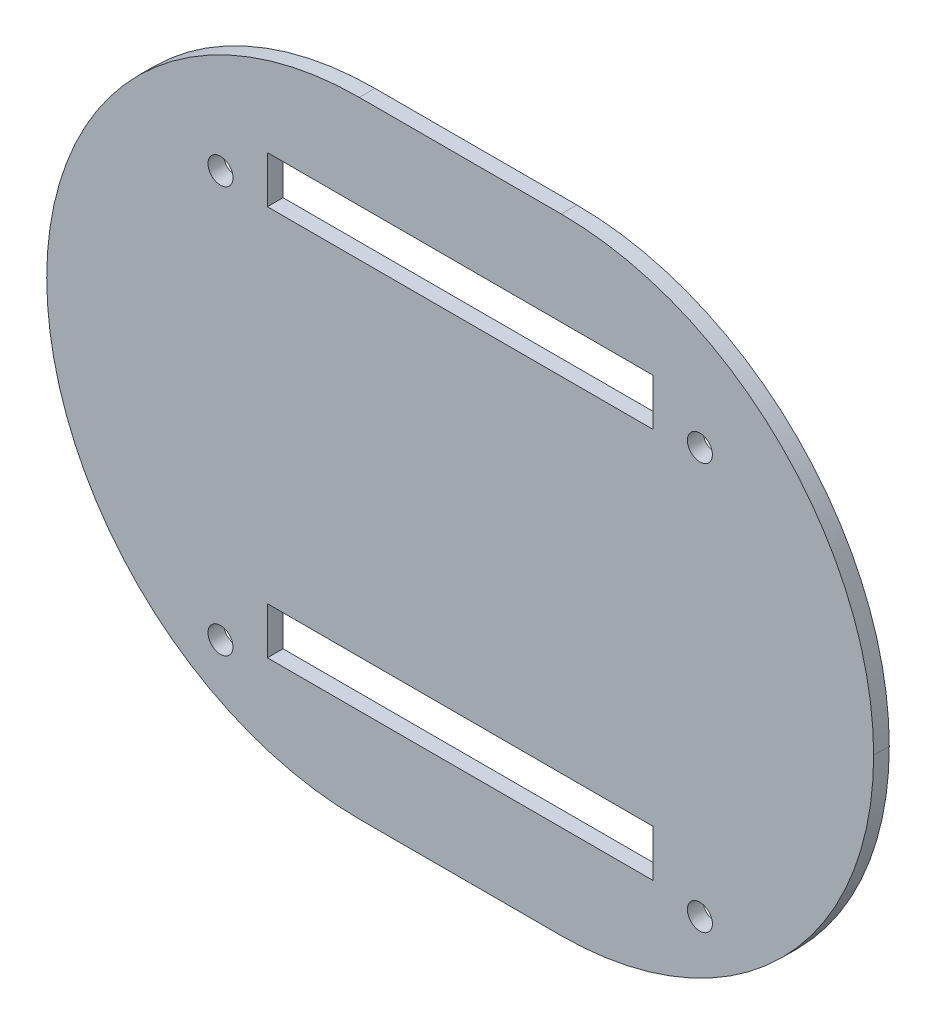
ISO-10303-21;
HEADER;
FILE_DESCRIPTION(('STEP AP214'),'2;1');
FILE_NAME('part.step','',(''),(''),'','','');
FILE_SCHEMA(('AUTOMOTIVE_DESIGN { 1 0 10303 214 1 1 1 1 }'));
ENDSEC;
DATA;
#1=APPLICATION_CONTEXT('core data for automotive mechanical design processes');
#2=APPLICATION_PROTOCOL_DEFINITION('international standard','automotive_design',2000,#1);
#3=PRODUCT_CONTEXT('',#1,'mechanical');
#4=PRODUCT('Part','Part','',(#3));
#5=PRODUCT_RELATED_PRODUCT_CATEGORY('part','',(#4));
#6=PRODUCT_DEFINITION_FORMATION('','',#4);
#7=PRODUCT_DEFINITION_CONTEXT('part definition',#1,'design');
#8=PRODUCT_DEFINITION('design','',#6,#7);
#9=PRODUCT_DEFINITION_SHAPE('','',#8);
#10=(LENGTH_UNIT() NAMED_UNIT(*) SI_UNIT(.MILLI.,.METRE.));
#11=(NAMED_UNIT(*) PLANE_ANGLE_UNIT() SI_UNIT($,.RADIAN.));
#12=(NAMED_UNIT(*) SI_UNIT($,.STERADIAN.) SOLID_ANGLE_UNIT());
#13=UNCERTAINTY_MEASURE_WITH_UNIT(LENGTH_MEASURE(1.E-05),#10,'distance_accuracy_value','');
#14=(GEOMETRIC_REPRESENTATION_CONTEXT(3) GLOBAL_UNCERTAINTY_ASSIGNED_CONTEXT((#13)) GLOBAL_UNIT_ASSIGNED_CONTEXT((#10,
#11,#12)) REPRESENTATION_CONTEXT('',''));
#15=CARTESIAN_POINT('',(0.,0.,0.));
#16=DIRECTION('',(0.,0.,1.));
#17=DIRECTION('',(1.,0.,0.));
#18=AXIS2_PLACEMENT_3D('',#15,#16,#17);
#19=CARTESIAN_POINT('',(0.,0.,0.));
#20=DIRECTION('',(0.,0.,-1.));
#21=DIRECTION('',(-1.,0.,0.));
#22=AXIS2_PLACEMENT_3D('',#19,#20,#21);
#23=PLANE('',#22);
#24=DIRECTION('',(0.,1.,0.));
#25=VECTOR('',#24,1.);
#26=CARTESIAN_POINT('',(-209.200541186636,-75.,0.));
#27=LINE('',#26,#25);
#28=CARTESIAN_POINT('',(-209.200541186636,-75.,0.));
#29=VERTEX_POINT('',#28);
#30=CARTESIAN_POINT('',(-209.200541186636,-60.,0.));
#31=VERTEX_POINT('',#30);
#32=EDGE_CURVE('E51',#29,#31,#27,.T.);
#33=ORIENTED_EDGE('',*,*,#32,.F.);
#34=DIRECTION('',(-1.,0.,0.));
#35=VECTOR('',#34,1.);
#36=CARTESIAN_POINT('',(-209.200541186636,-75.,0.));
#37=LINE('',#36,#35);
#38=CARTESIAN_POINT('',(-85.7994588132849,-75.,0.));
#39=VERTEX_POINT('',#38);
#40=EDGE_CURVE('E157',#39,#29,#37,.T.);
#41=ORIENTED_EDGE('',*,*,#40,.F.);
#42=DIRECTION('',(0.,-1.,0.));
#43=VECTOR('',#42,1.);
#44=CARTESIAN_POINT('',(-85.7994588132849,-75.,0.));
#45=LINE('',#44,#43);
#46=CARTESIAN_POINT('',(-85.7994588132849,-60.,0.));
#47=VERTEX_POINT('',#46);
#48=EDGE_CURVE('E160',#47,#39,#45,.T.);
#49=ORIENTED_EDGE('',*,*,#48,.F.);
#50=DIRECTION('',(1.,0.,0.));
#51=VECTOR('',#50,1.);
#52=CARTESIAN_POINT('',(-209.200541186636,-60.,0.));
#53=LINE('',#52,#51);
#54=EDGE_CURVE('E166',#31,#47,#53,.T.);
#55=ORIENTED_EDGE('',*,*,#54,.F.);
#56=EDGE_LOOP('',(#33,#41,#49,#55));
#57=FACE_BOUND('',#56,.T.);
#58=DIRECTION('',(1.,0.,0.));
#59=VECTOR('',#58,1.);
#60=CARTESIAN_POINT('',(-209.200541186636,-185.,0.));
#61=LINE('',#60,#59);
#62=CARTESIAN_POINT('',(-209.200541186636,-185.,0.));
#63=VERTEX_POINT('',#62);
#64=CARTESIAN_POINT('',(-85.7994588132849,-185.,0.));
#65=VERTEX_POINT('',#64);
#66=EDGE_CURVE('E59',#63,#65,#61,.T.);
#67=ORIENTED_EDGE('',*,*,#66,.F.);
#68=DIRECTION('',(0.,1.,0.));
#69=VECTOR('',#68,1.);
#70=CARTESIAN_POINT('',(-209.200541186636,-185.,0.));
#71=LINE('',#70,#69);
#72=CARTESIAN_POINT('',(-209.200541186636,-200.,0.));
#73=VERTEX_POINT('',#72);
#74=EDGE_CURVE('E181',#73,#63,#71,.T.);
#75=ORIENTED_EDGE('',*,*,#74,.F.);
#76=DIRECTION('',(-1.,0.,0.));
#77=VECTOR('',#76,1.);
#78=CARTESIAN_POINT('',(-209.200541186636,-200.,0.));
#79=LINE('',#78,#77);
#80=CARTESIAN_POINT('',(-85.7994588132849,-200.,0.));
#81=VERTEX_POINT('',#80);
#82=EDGE_CURVE('E195',#81,#73,#79,.T.);
#83=ORIENTED_EDGE('',*,*,#82,.F.);
#84=DIRECTION('',(0.,-1.,0.));
#85=VECTOR('',#84,1.);
#86=CARTESIAN_POINT('',(-85.7994588132849,-185.,0.));
#87=LINE('',#86,#85);
#88=EDGE_CURVE('E192',#65,#81,#87,.T.);
#89=ORIENTED_EDGE('',*,*,#88,.F.);
#90=EDGE_LOOP('',(#67,#75,#83,#89));
#91=FACE_BOUND('',#90,.T.);
#92=CARTESIAN_POINT('',(-224.200541186636,-202.530608434768,0.));
#93=DIRECTION('',(0.,0.,1.));
#94=DIRECTION('',(1.,0.,0.));
#95=AXIS2_PLACEMENT_3D('',#92,#93,#94);
#96=CIRCLE('',#95,4.);
#97=CARTESIAN_POINT('',(-220.200541186636,-202.530608434768,0.));
#98=VERTEX_POINT('',#97);
#99=EDGE_CURVE('E206',#98,#98,#96,.F.);
#100=ORIENTED_EDGE('',*,*,#99,.F.);
#101=EDGE_LOOP('',(#100));
#102=FACE_BOUND('',#101,.T.);
#103=CARTESIAN_POINT('',(-70.7994588132849,-202.530608434768,0.));
#104=DIRECTION('',(0.,0.,1.));
#105=DIRECTION('',(1.,0.,0.));
#106=AXIS2_PLACEMENT_3D('',#103,#104,#105);
#107=CIRCLE('',#106,4.00000000000001);
#108=CARTESIAN_POINT('',(-66.7994588132849,-202.530608434768,0.));
#109=VERTEX_POINT('',#108);
#110=EDGE_CURVE('E224',#109,#109,#107,.T.);
#111=ORIENTED_EDGE('',*,*,#110,.T.);
#112=EDGE_LOOP('',(#111));
#113=FACE_BOUND('',#112,.T.);
#114=CARTESIAN_POINT('',(-179.8,-130.,0.));
#115=DIRECTION('',(0.,0.,-1.));
#116=DIRECTION('',(-1.,0.,0.));
#117=AXIS2_PLACEMENT_3D('',#114,#115,#116);
#118=CIRCLE('',#117,100.);
#119=CARTESIAN_POINT('',(-179.8,-230.,0.));
#120=VERTEX_POINT('',#119);
#121=CARTESIAN_POINT('',(-279.8,-130.,0.));
#122=VERTEX_POINT('',#121);
#123=EDGE_CURVE('E246',#120,#122,#118,.T.);
#124=ORIENTED_EDGE('',*,*,#123,.T.);
#125=CARTESIAN_POINT('',(-179.8,-130.,0.));
#126=DIRECTION('',(0.,0.,-1.));
#127=DIRECTION('',(-1.,0.,0.));
#128=AXIS2_PLACEMENT_3D('',#125,#126,#127);
#129=CIRCLE('',#128,100.);
#130=CARTESIAN_POINT('',(-179.8,-30.,0.));
#131=VERTEX_POINT('',#130);
#132=EDGE_CURVE('E248',#122,#131,#129,.T.);
#133=ORIENTED_EDGE('',*,*,#132,.T.);
#134=DIRECTION('',(1.,0.,0.));
#135=VECTOR('',#134,1.);
#136=CARTESIAN_POINT('',(-15.2,-30.,0.));
#137=LINE('',#136,#135);
#138=CARTESIAN_POINT('',(-115.2,-30.,0.));
#139=VERTEX_POINT('',#138);
#140=EDGE_CURVE('E237',#131,#139,#137,.T.);
#141=ORIENTED_EDGE('',*,*,#140,.T.);
#142=CARTESIAN_POINT('',(-115.2,-130.,0.));
#143=DIRECTION('',(0.,0.,-1.));
#144=DIRECTION('',(-1.,0.,0.));
#145=AXIS2_PLACEMENT_3D('',#142,#143,#144);
#146=CIRCLE('',#145,100.);
#147=CARTESIAN_POINT('',(-15.2,-130.,0.));
#148=VERTEX_POINT('',#147);
#149=EDGE_CURVE('E244',#139,#148,#146,.T.);
#150=ORIENTED_EDGE('',*,*,#149,.T.);
#151=CARTESIAN_POINT('',(-115.2,-130.,0.));
#152=DIRECTION('',(0.,0.,-1.));
#153=DIRECTION('',(-1.,0.,0.));
#154=AXIS2_PLACEMENT_3D('',#151,#152,#153);
#155=CIRCLE('',#154,100.);
#156=CARTESIAN_POINT('',(-115.2,-230.,0.));
#157=VERTEX_POINT('',#156);
#158=EDGE_CURVE('E236',#148,#157,#155,.T.);
#159=ORIENTED_EDGE('',*,*,#158,.T.);
#160=DIRECTION('',(-1.,0.,0.));
#161=VECTOR('',#160,1.);
#162=CARTESIAN_POINT('',(-15.2,-230.,0.));
#163=LINE('',#162,#161);
#164=EDGE_CURVE('E233',#157,#120,#163,.T.);
#165=ORIENTED_EDGE('',*,*,#164,.T.);
#166=EDGE_LOOP('',(#124,#133,#141,#150,#159,#165));
#167=FACE_BOUND('',#166,.T.);
#168=CARTESIAN_POINT('',(-224.200541186636,-72.5306084347679,0.));
#169=DIRECTION('',(0.,0.,1.));
#170=DIRECTION('',(1.,0.,0.));
#171=AXIS2_PLACEMENT_3D('',#168,#169,#170);
#172=CIRCLE('',#171,3.99999999999999);
#173=CARTESIAN_POINT('',(-220.200541186636,-72.5306084347679,0.));
#174=VERTEX_POINT('',#173);
#175=EDGE_CURVE('E213',#174,#174,#172,.T.);
#176=ORIENTED_EDGE('',*,*,#175,.T.);
#177=EDGE_LOOP('',(#176));
#178=FACE_BOUND('',#177,.T.);
#179=CARTESIAN_POINT('',(-70.7994588132848,-72.5306084347679,0.));
#180=DIRECTION('',(0.,0.,1.));
#181=DIRECTION('',(1.,0.,0.));
#182=AXIS2_PLACEMENT_3D('',#179,#180,#181);
#183=CIRCLE('',#182,3.99999999999994);
#184=CARTESIAN_POINT('',(-66.7994588132849,-72.5306084347679,0.));
#185=VERTEX_POINT('',#184);
#186=EDGE_CURVE('E219',#185,#185,#183,.F.);
#187=ORIENTED_EDGE('',*,*,#186,.F.);
#188=EDGE_LOOP('',(#187));
#189=FACE_BOUND('',#188,.T.);
#190=ADVANCED_FACE('F34',(#57,#91,#102,#113,#167,#178,#189),#23,.T.);
#191=CARTESIAN_POINT('',(0.,0.,5.));
#192=DIRECTION('',(0.,0.,-1.));
#193=DIRECTION('',(-1.,0.,0.));
#194=AXIS2_PLACEMENT_3D('',#191,#192,#193);
#195=PLANE('',#194);
#196=DIRECTION('',(-1.,0.,0.));
#197=VECTOR('',#196,1.);
#198=CARTESIAN_POINT('',(-209.200541186636,-75.,5.));
#199=LINE('',#198,#197);
#200=CARTESIAN_POINT('',(-85.7994588132849,-75.,5.));
#201=VERTEX_POINT('',#200);
#202=CARTESIAN_POINT('',(-209.200541186636,-75.,5.));
#203=VERTEX_POINT('',#202);
#204=EDGE_CURVE('E144',#201,#203,#199,.T.);
#205=ORIENTED_EDGE('',*,*,#204,.T.);
#206=DIRECTION('',(0.,1.,0.));
#207=VECTOR('',#206,1.);
#208=CARTESIAN_POINT('',(-209.200541186636,-75.,5.));
#209=LINE('',#208,#207);
#210=CARTESIAN_POINT('',(-209.200541186636,-60.,5.));
#211=VERTEX_POINT('',#210);
#212=EDGE_CURVE('E138',#203,#211,#209,.T.);
#213=ORIENTED_EDGE('',*,*,#212,.T.);
#214=DIRECTION('',(1.,0.,0.));
#215=VECTOR('',#214,1.);
#216=CARTESIAN_POINT('',(-209.200541186636,-60.,5.));
#217=LINE('',#216,#215);
#218=CARTESIAN_POINT('',(-85.7994588132849,-60.,5.));
#219=VERTEX_POINT('',#218);
#220=EDGE_CURVE('E148',#211,#219,#217,.T.);
#221=ORIENTED_EDGE('',*,*,#220,.T.);
#222=DIRECTION('',(0.,-1.,0.));
#223=VECTOR('',#222,1.);
#224=CARTESIAN_POINT('',(-85.7994588132849,-75.,5.));
#225=LINE('',#224,#223);
#226=EDGE_CURVE('E152',#219,#201,#225,.T.);
#227=ORIENTED_EDGE('',*,*,#226,.T.);
#228=EDGE_LOOP('',(#205,#213,#221,#227));
#229=FACE_BOUND('',#228,.T.);
#230=DIRECTION('',(0.,1.,0.));
#231=VECTOR('',#230,1.);
#232=CARTESIAN_POINT('',(-209.200541186636,-185.,5.));
#233=LINE('',#232,#231);
#234=CARTESIAN_POINT('',(-209.200541186636,-200.,5.));
#235=VERTEX_POINT('',#234);
#236=CARTESIAN_POINT('',(-209.200541186636,-185.,5.));
#237=VERTEX_POINT('',#236);
#238=EDGE_CURVE('E187',#235,#237,#233,.T.);
#239=ORIENTED_EDGE('',*,*,#238,.T.);
#240=DIRECTION('',(1.,0.,0.));
#241=VECTOR('',#240,1.);
#242=CARTESIAN_POINT('',(-209.200541186636,-185.,5.));
#243=LINE('',#242,#241);
#244=CARTESIAN_POINT('',(-85.7994588132849,-185.,5.));
#245=VERTEX_POINT('',#244);
#246=EDGE_CURVE('E177',#237,#245,#243,.T.);
#247=ORIENTED_EDGE('',*,*,#246,.T.);
#248=DIRECTION('',(0.,-1.,0.));
#249=VECTOR('',#248,1.);
#250=CARTESIAN_POINT('',(-85.7994588132849,-185.,5.));
#251=LINE('',#250,#249);
#252=CARTESIAN_POINT('',(-85.7994588132849,-200.,5.));
#253=VERTEX_POINT('',#252);
#254=EDGE_CURVE('E180',#245,#253,#251,.T.);
#255=ORIENTED_EDGE('',*,*,#254,.T.);
#256=DIRECTION('',(-1.,0.,0.));
#257=VECTOR('',#256,1.);
#258=CARTESIAN_POINT('',(-209.200541186636,-200.,5.));
#259=LINE('',#258,#257);
#260=EDGE_CURVE('E184',#253,#235,#259,.T.);
#261=ORIENTED_EDGE('',*,*,#260,.T.);
#262=EDGE_LOOP('',(#239,#247,#255,#261));
#263=FACE_BOUND('',#262,.T.);
#264=CARTESIAN_POINT('',(-224.200541186636,-72.5306084347679,5.));
#265=DIRECTION('',(0.,0.,1.));
#266=DIRECTION('',(1.,0.,0.));
#267=AXIS2_PLACEMENT_3D('',#264,#265,#266);
#268=CIRCLE('',#267,3.99999999999999);
#269=CARTESIAN_POINT('',(-220.200541186636,-72.5306084347679,5.));
#270=VERTEX_POINT('',#269);
#271=EDGE_CURVE('E216',#270,#270,#268,.T.);
#272=ORIENTED_EDGE('',*,*,#271,.F.);
#273=EDGE_LOOP('',(#272));
#274=FACE_BOUND('',#273,.T.);
#275=CARTESIAN_POINT('',(-70.7994588132849,-202.530608434768,5.));
#276=DIRECTION('',(0.,0.,1.));
#277=DIRECTION('',(1.,0.,0.));
#278=AXIS2_PLACEMENT_3D('',#275,#276,#277);
#279=CIRCLE('',#278,4.00000000000001);
#280=CARTESIAN_POINT('',(-66.7994588132849,-202.530608434768,5.));
#281=VERTEX_POINT('',#280);
#282=EDGE_CURVE('E209',#281,#281,#279,.T.);
#283=ORIENTED_EDGE('',*,*,#282,.F.);
#284=EDGE_LOOP('',(#283));
#285=FACE_BOUND('',#284,.T.);
#286=DIRECTION('',(1.,0.,0.));
#287=VECTOR('',#286,1.);
#288=CARTESIAN_POINT('',(-15.2,-30.,5.));
#289=LINE('',#288,#287);
#290=CARTESIAN_POINT('',(-179.8,-30.,5.));
#291=VERTEX_POINT('',#290);
#292=CARTESIAN_POINT('',(-115.2,-30.,5.));
#293=VERTEX_POINT('',#292);
#294=EDGE_CURVE('E229',#291,#293,#289,.T.);
#295=ORIENTED_EDGE('',*,*,#294,.F.);
#296=CARTESIAN_POINT('',(-179.8,-130.,5.));
#297=DIRECTION('',(0.,0.,-1.));
#298=DIRECTION('',(-1.,0.,0.));
#299=AXIS2_PLACEMENT_3D('',#296,#297,#298);
#300=CIRCLE('',#299,100.);
#301=CARTESIAN_POINT('',(-279.8,-130.,5.));
#302=VERTEX_POINT('',#301);
#303=EDGE_CURVE('E262',#291,#302,#300,.F.);
#304=ORIENTED_EDGE('',*,*,#303,.T.);
#305=CARTESIAN_POINT('',(-179.8,-130.,5.));
#306=DIRECTION('',(0.,0.,-1.));
#307=DIRECTION('',(-1.,0.,0.));
#308=AXIS2_PLACEMENT_3D('',#305,#306,#307);
#309=CIRCLE('',#308,100.);
#310=CARTESIAN_POINT('',(-179.8,-230.,5.));
#311=VERTEX_POINT('',#310);
#312=EDGE_CURVE('E260',#302,#311,#309,.F.);
#313=ORIENTED_EDGE('',*,*,#312,.T.);
#314=DIRECTION('',(-1.,0.,0.));
#315=VECTOR('',#314,1.);
#316=CARTESIAN_POINT('',(-15.2,-230.,5.));
#317=LINE('',#316,#315);
#318=CARTESIAN_POINT('',(-115.2,-230.,5.));
#319=VERTEX_POINT('',#318);
#320=EDGE_CURVE('E232',#319,#311,#317,.T.);
#321=ORIENTED_EDGE('',*,*,#320,.F.);
#322=CARTESIAN_POINT('',(-115.2,-130.,5.));
#323=DIRECTION('',(0.,0.,-1.));
#324=DIRECTION('',(-1.,0.,0.));
#325=AXIS2_PLACEMENT_3D('',#322,#323,#324);
#326=CIRCLE('',#325,100.);
#327=CARTESIAN_POINT('',(-15.2,-130.,5.));
#328=VERTEX_POINT('',#327);
#329=EDGE_CURVE('E256',#319,#328,#326,.F.);
#330=ORIENTED_EDGE('',*,*,#329,.T.);
#331=CARTESIAN_POINT('',(-115.2,-130.,5.));
#332=DIRECTION('',(0.,0.,-1.));
#333=DIRECTION('',(-1.,0.,0.));
#334=AXIS2_PLACEMENT_3D('',#331,#332,#333);
#335=CIRCLE('',#334,100.);
#336=EDGE_CURVE('E258',#328,#293,#335,.F.);
#337=ORIENTED_EDGE('',*,*,#336,.T.);
#338=EDGE_LOOP('',(#295,#304,#313,#321,#330,#337));
#339=FACE_BOUND('',#338,.T.);
#340=CARTESIAN_POINT('',(-224.200541186636,-202.530608434768,5.));
#341=DIRECTION('',(0.,0.,1.));
#342=DIRECTION('',(1.,0.,0.));
#343=AXIS2_PLACEMENT_3D('',#340,#341,#342);
#344=CIRCLE('',#343,4.);
#345=CARTESIAN_POINT('',(-220.200541186636,-202.530608434768,5.));
#346=VERTEX_POINT('',#345);
#347=EDGE_CURVE('E210',#346,#346,#344,.F.);
#348=ORIENTED_EDGE('',*,*,#347,.T.);
#349=EDGE_LOOP('',(#348));
#350=FACE_BOUND('',#349,.T.);
#351=CARTESIAN_POINT('',(-70.7994588132848,-72.5306084347679,5.));
#352=DIRECTION('',(0.,0.,1.));
#353=DIRECTION('',(1.,0.,0.));
#354=AXIS2_PLACEMENT_3D('',#351,#352,#353);
#355=CIRCLE('',#354,3.99999999999994);
#356=CARTESIAN_POINT('',(-66.7994588132849,-72.5306084347679,5.));
#357=VERTEX_POINT('',#356);
#358=EDGE_CURVE('E173',#357,#357,#355,.F.);
#359=ORIENTED_EDGE('',*,*,#358,.T.);
#360=EDGE_LOOP('',(#359));
#361=FACE_BOUND('',#360,.T.);
#362=ADVANCED_FACE('F154',(#229,#263,#274,#285,#339,#350,#361),#195,.F.);
#363=CARTESIAN_POINT('',(-15.2,-230.,5.));
#364=DIRECTION('',(0.,-1.,0.));
#365=DIRECTION('',(0.,0.,-1.));
#366=AXIS2_PLACEMENT_3D('',#363,#364,#365);
#367=PLANE('',#366);
#368=ORIENTED_EDGE('',*,*,#320,.T.);
#369=DIRECTION('',(0.,0.,-1.));
#370=VECTOR('',#369,1.);
#371=CARTESIAN_POINT('',(-179.8,-230.,5.));
#372=LINE('',#371,#370);
#373=EDGE_CURVE('E12',#311,#120,#372,.T.);
#374=ORIENTED_EDGE('',*,*,#373,.T.);
#375=ORIENTED_EDGE('',*,*,#164,.F.);
#376=DIRECTION('',(0.,0.,-1.));
#377=VECTOR('',#376,1.);
#378=CARTESIAN_POINT('',(-115.2,-230.,5.));
#379=LINE('',#378,#377);
#380=EDGE_CURVE('E43',#157,#319,#379,.F.);
#381=ORIENTED_EDGE('',*,*,#380,.T.);
#382=EDGE_LOOP('',(#368,#374,#375,#381));
#383=FACE_BOUND('',#382,.T.);
#384=ADVANCED_FACE('F283',(#383),#367,.T.);
#385=CARTESIAN_POINT('',(-15.2,-30.,5.));
#386=DIRECTION('',(0.,1.,0.));
#387=DIRECTION('',(0.,0.,1.));
#388=AXIS2_PLACEMENT_3D('',#385,#386,#387);
#389=PLANE('',#388);
#390=ORIENTED_EDGE('',*,*,#140,.F.);
#391=DIRECTION('',(0.,0.,-1.));
#392=VECTOR('',#391,1.);
#393=CARTESIAN_POINT('',(-179.8,-30.,5.));
#394=LINE('',#393,#392);
#395=EDGE_CURVE('E253',#131,#291,#394,.F.);
#396=ORIENTED_EDGE('',*,*,#395,.T.);
#397=ORIENTED_EDGE('',*,*,#294,.T.);
#398=DIRECTION('',(0.,0.,-1.));
#399=VECTOR('',#398,1.);
#400=CARTESIAN_POINT('',(-115.2,-30.,5.));
#401=LINE('',#400,#399);
#402=EDGE_CURVE('E250',#293,#139,#401,.T.);
#403=ORIENTED_EDGE('',*,*,#402,.T.);
#404=EDGE_LOOP('',(#390,#396,#397,#403));
#405=FACE_BOUND('',#404,.T.);
#406=ADVANCED_FACE('F292',(#405),#389,.T.);
#407=CARTESIAN_POINT('',(-179.8,-130.,5.));
#408=DIRECTION('',(0.,0.,-1.));
#409=DIRECTION('',(-1.,0.,0.));
#410=AXIS2_PLACEMENT_3D('',#407,#408,#409);
#411=CYLINDRICAL_SURFACE('',#410,100.);
#412=ORIENTED_EDGE('',*,*,#373,.F.);
#413=ORIENTED_EDGE('',*,*,#312,.F.);
#414=DIRECTION('',(0.,0.,-1.));
#415=VECTOR('',#414,1.);
#416=CARTESIAN_POINT('',(-279.8,-130.,5.));
#417=LINE('',#416,#415);
#418=EDGE_CURVE('E240',#122,#302,#417,.F.);
#419=ORIENTED_EDGE('',*,*,#418,.F.);
#420=ORIENTED_EDGE('',*,*,#123,.F.);
#421=EDGE_LOOP('',(#412,#413,#419,#420));
#422=FACE_BOUND('',#421,.T.);
#423=ADVANCED_FACE('F288',(#422),#411,.T.);
#424=CARTESIAN_POINT('',(-179.8,-130.,5.));
#425=DIRECTION('',(0.,0.,-1.));
#426=DIRECTION('',(-1.,0.,0.));
#427=AXIS2_PLACEMENT_3D('',#424,#425,#426);
#428=CYLINDRICAL_SURFACE('',#427,100.);
#429=ORIENTED_EDGE('',*,*,#303,.F.);
#430=ORIENTED_EDGE('',*,*,#395,.F.);
#431=ORIENTED_EDGE('',*,*,#132,.F.);
#432=ORIENTED_EDGE('',*,*,#418,.T.);
#433=EDGE_LOOP('',(#429,#430,#431,#432));
#434=FACE_BOUND('',#433,.T.);
#435=ADVANCED_FACE('F294',(#434),#428,.T.);
#436=CARTESIAN_POINT('',(-115.2,-130.,5.));
#437=DIRECTION('',(0.,0.,-1.));
#438=DIRECTION('',(-1.,0.,0.));
#439=AXIS2_PLACEMENT_3D('',#436,#437,#438);
#440=CYLINDRICAL_SURFACE('',#439,100.);
#441=DIRECTION('',(0.,0.,-1.));
#442=VECTOR('',#441,1.);
#443=CARTESIAN_POINT('',(-15.2,-130.,5.));
#444=LINE('',#443,#442);
#445=EDGE_CURVE('E38',#328,#148,#444,.T.);
#446=ORIENTED_EDGE('',*,*,#445,.F.);
#447=ORIENTED_EDGE('',*,*,#329,.F.);
#448=ORIENTED_EDGE('',*,*,#380,.F.);
#449=ORIENTED_EDGE('',*,*,#158,.F.);
#450=EDGE_LOOP('',(#446,#447,#448,#449));
#451=FACE_BOUND('',#450,.T.);
#452=ADVANCED_FACE('F36',(#451),#440,.T.);
#453=CARTESIAN_POINT('',(-115.2,-130.,5.));
#454=DIRECTION('',(0.,0.,-1.));
#455=DIRECTION('',(-1.,0.,0.));
#456=AXIS2_PLACEMENT_3D('',#453,#454,#455);
#457=CYLINDRICAL_SURFACE('',#456,100.);
#458=ORIENTED_EDGE('',*,*,#336,.F.);
#459=ORIENTED_EDGE('',*,*,#445,.T.);
#460=ORIENTED_EDGE('',*,*,#149,.F.);
#461=ORIENTED_EDGE('',*,*,#402,.F.);
#462=EDGE_LOOP('',(#458,#459,#460,#461));
#463=FACE_BOUND('',#462,.T.);
#464=ADVANCED_FACE('F272',(#463),#457,.T.);
#465=CARTESIAN_POINT('',(-70.7994588132849,-202.530608434768,0.));
#466=DIRECTION('',(0.,0.,1.));
#467=DIRECTION('',(1.,0.,0.));
#468=AXIS2_PLACEMENT_3D('',#465,#466,#467);
#469=CYLINDRICAL_SURFACE('',#468,4.00000000000001);
#470=ORIENTED_EDGE('',*,*,#110,.F.);
#471=EDGE_LOOP('',(#470));
#472=FACE_BOUND('',#471,.T.);
#473=ORIENTED_EDGE('',*,*,#282,.T.);
#474=EDGE_LOOP('',(#473));
#475=FACE_BOUND('',#474,.T.);
#476=ADVANCED_FACE('F331',(#472,#475),#469,.F.);
#477=CARTESIAN_POINT('',(-224.200541186636,-202.530608434768,0.));
#478=DIRECTION('',(0.,0.,1.));
#479=DIRECTION('',(1.,0.,0.));
#480=AXIS2_PLACEMENT_3D('',#477,#478,#479);
#481=CYLINDRICAL_SURFACE('',#480,4.);
#482=ORIENTED_EDGE('',*,*,#99,.T.);
#483=EDGE_LOOP('',(#482));
#484=FACE_BOUND('',#483,.T.);
#485=ORIENTED_EDGE('',*,*,#347,.F.);
#486=EDGE_LOOP('',(#485));
#487=FACE_BOUND('',#486,.T.);
#488=ADVANCED_FACE('F315',(#484,#487),#481,.F.);
#489=CARTESIAN_POINT('',(-224.200541186636,-72.5306084347679,0.));
#490=DIRECTION('',(0.,0.,1.));
#491=DIRECTION('',(1.,0.,0.));
#492=AXIS2_PLACEMENT_3D('',#489,#490,#491);
#493=CYLINDRICAL_SURFACE('',#492,3.99999999999999);
#494=ORIENTED_EDGE('',*,*,#175,.F.);
#495=EDGE_LOOP('',(#494));
#496=FACE_BOUND('',#495,.T.);
#497=ORIENTED_EDGE('',*,*,#271,.T.);
#498=EDGE_LOOP('',(#497));
#499=FACE_BOUND('',#498,.T.);
#500=ADVANCED_FACE('F306',(#496,#499),#493,.F.);
#501=CARTESIAN_POINT('',(-70.7994588132848,-72.5306084347679,0.));
#502=DIRECTION('',(0.,0.,1.));
#503=DIRECTION('',(1.,0.,0.));
#504=AXIS2_PLACEMENT_3D('',#501,#502,#503);
#505=CYLINDRICAL_SURFACE('',#504,3.99999999999994);
#506=ORIENTED_EDGE('',*,*,#186,.T.);
#507=EDGE_LOOP('',(#506));
#508=FACE_BOUND('',#507,.T.);
#509=ORIENTED_EDGE('',*,*,#358,.F.);
#510=EDGE_LOOP('',(#509));
#511=FACE_BOUND('',#510,.T.);
#512=ADVANCED_FACE('F303',(#508,#511),#505,.F.);
#513=CARTESIAN_POINT('',(-209.200541186636,-185.,5.));
#514=DIRECTION('',(0.,1.,0.));
#515=DIRECTION('',(0.,0.,1.));
#516=AXIS2_PLACEMENT_3D('',#513,#514,#515);
#517=PLANE('',#516);
#518=ORIENTED_EDGE('',*,*,#66,.T.);
#519=DIRECTION('',(0.,0.,-1.));
#520=VECTOR('',#519,1.);
#521=CARTESIAN_POINT('',(-85.7994588132849,-185.,5.));
#522=LINE('',#521,#520);
#523=EDGE_CURVE('E190',#245,#65,#522,.T.);
#524=ORIENTED_EDGE('',*,*,#523,.F.);
#525=ORIENTED_EDGE('',*,*,#246,.F.);
#526=DIRECTION('',(0.,0.,-1.));
#527=VECTOR('',#526,1.);
#528=CARTESIAN_POINT('',(-209.200541186636,-185.,5.));
#529=LINE('',#528,#527);
#530=EDGE_CURVE('E167',#237,#63,#529,.T.);
#531=ORIENTED_EDGE('',*,*,#530,.T.);
#532=EDGE_LOOP('',(#518,#524,#525,#531));
#533=FACE_BOUND('',#532,.T.);
#534=ADVANCED_FACE('F305',(#533),#517,.F.);
#535=CARTESIAN_POINT('',(-209.200541186636,-185.,5.));
#536=DIRECTION('',(-1.,0.,0.));
#537=DIRECTION('',(0.,0.,1.));
#538=AXIS2_PLACEMENT_3D('',#535,#536,#537);
#539=PLANE('',#538);
#540=ORIENTED_EDGE('',*,*,#74,.T.);
#541=ORIENTED_EDGE('',*,*,#530,.F.);
#542=ORIENTED_EDGE('',*,*,#238,.F.);
#543=DIRECTION('',(0.,0.,-1.));
#544=VECTOR('',#543,1.);
#545=CARTESIAN_POINT('',(-209.200541186636,-200.,5.));
#546=LINE('',#545,#544);
#547=EDGE_CURVE('E201',#235,#73,#546,.T.);
#548=ORIENTED_EDGE('',*,*,#547,.T.);
#549=EDGE_LOOP('',(#540,#541,#542,#548));
#550=FACE_BOUND('',#549,.T.);
#551=ADVANCED_FACE('F313',(#550),#539,.F.);
#552=CARTESIAN_POINT('',(-209.200541186636,-200.,5.));
#553=DIRECTION('',(0.,-1.,0.));
#554=DIRECTION('',(0.,0.,-1.));
#555=AXIS2_PLACEMENT_3D('',#552,#553,#554);
#556=PLANE('',#555);
#557=ORIENTED_EDGE('',*,*,#82,.T.);
#558=ORIENTED_EDGE('',*,*,#547,.F.);
#559=ORIENTED_EDGE('',*,*,#260,.F.);
#560=DIRECTION('',(0.,0.,-1.));
#561=VECTOR('',#560,1.);
#562=CARTESIAN_POINT('',(-85.7994588132849,-200.,5.));
#563=LINE('',#562,#561);
#564=EDGE_CURVE('E203',#253,#81,#563,.T.);
#565=ORIENTED_EDGE('',*,*,#564,.T.);
#566=EDGE_LOOP('',(#557,#558,#559,#565));
#567=FACE_BOUND('',#566,.T.);
#568=ADVANCED_FACE('F381',(#567),#556,.F.);
#569=CARTESIAN_POINT('',(-85.7994588132849,-185.,5.));
#570=DIRECTION('',(1.,0.,0.));
#571=DIRECTION('',(0.,0.,-1.));
#572=AXIS2_PLACEMENT_3D('',#569,#570,#571);
#573=PLANE('',#572);
#574=ORIENTED_EDGE('',*,*,#88,.T.);
#575=ORIENTED_EDGE('',*,*,#564,.F.);
#576=ORIENTED_EDGE('',*,*,#254,.F.);
#577=ORIENTED_EDGE('',*,*,#523,.T.);
#578=EDGE_LOOP('',(#574,#575,#576,#577));
#579=FACE_BOUND('',#578,.T.);
#580=ADVANCED_FACE('F391',(#579),#573,.F.);
#581=CARTESIAN_POINT('',(-209.200541186636,-75.,5.));
#582=DIRECTION('',(-1.,0.,0.));
#583=DIRECTION('',(0.,0.,1.));
#584=AXIS2_PLACEMENT_3D('',#581,#582,#583);
#585=PLANE('',#584);
#586=ORIENTED_EDGE('',*,*,#32,.T.);
#587=DIRECTION('',(0.,0.,-1.));
#588=VECTOR('',#587,1.);
#589=CARTESIAN_POINT('',(-209.200541186636,-60.,5.));
#590=LINE('',#589,#588);
#591=EDGE_CURVE('E134',#211,#31,#590,.T.);
#592=ORIENTED_EDGE('',*,*,#591,.F.);
#593=ORIENTED_EDGE('',*,*,#212,.F.);
#594=DIRECTION('',(0.,0.,-1.));
#595=VECTOR('',#594,1.);
#596=CARTESIAN_POINT('',(-209.200541186636,-75.,5.));
#597=LINE('',#596,#595);
#598=EDGE_CURVE('E171',#203,#29,#597,.T.);
#599=ORIENTED_EDGE('',*,*,#598,.T.);
#600=EDGE_LOOP('',(#586,#592,#593,#599));
#601=FACE_BOUND('',#600,.T.);
#602=ADVANCED_FACE('F136',(#601),#585,.F.);
#603=CARTESIAN_POINT('',(-209.200541186636,-75.,5.));
#604=DIRECTION('',(0.,-1.,0.));
#605=DIRECTION('',(0.,0.,-1.));
#606=AXIS2_PLACEMENT_3D('',#603,#604,#605);
#607=PLANE('',#606);
#608=ORIENTED_EDGE('',*,*,#40,.T.);
#609=ORIENTED_EDGE('',*,*,#598,.F.);
#610=ORIENTED_EDGE('',*,*,#204,.F.);
#611=DIRECTION('',(0.,0.,-1.));
#612=VECTOR('',#611,1.);
#613=CARTESIAN_POINT('',(-85.7994588132849,-75.,5.));
#614=LINE('',#613,#612);
#615=EDGE_CURVE('E174',#201,#39,#614,.T.);
#616=ORIENTED_EDGE('',*,*,#615,.T.);
#617=EDGE_LOOP('',(#608,#609,#610,#616));
#618=FACE_BOUND('',#617,.T.);
#619=ADVANCED_FACE('F410',(#618),#607,.F.);
#620=CARTESIAN_POINT('',(-85.7994588132849,-75.,5.));
#621=DIRECTION('',(1.,0.,0.));
#622=DIRECTION('',(0.,0.,-1.));
#623=AXIS2_PLACEMENT_3D('',#620,#621,#622);
#624=PLANE('',#623);
#625=ORIENTED_EDGE('',*,*,#48,.T.);
#626=ORIENTED_EDGE('',*,*,#615,.F.);
#627=ORIENTED_EDGE('',*,*,#226,.F.);
#628=DIRECTION('',(0.,0.,-1.));
#629=VECTOR('',#628,1.);
#630=CARTESIAN_POINT('',(-85.7994588132849,-60.,5.));
#631=LINE('',#630,#629);
#632=EDGE_CURVE('E143',#219,#47,#631,.T.);
#633=ORIENTED_EDGE('',*,*,#632,.T.);
#634=EDGE_LOOP('',(#625,#626,#627,#633));
#635=FACE_BOUND('',#634,.T.);
#636=ADVANCED_FACE('F419',(#635),#624,.F.);
#637=CARTESIAN_POINT('',(-209.200541186636,-60.,5.));
#638=DIRECTION('',(0.,1.,0.));
#639=DIRECTION('',(-1.,0.,0.));
#640=AXIS2_PLACEMENT_3D('',#637,#638,#639);
#641=PLANE('',#640);
#642=ORIENTED_EDGE('',*,*,#54,.T.);
#643=ORIENTED_EDGE('',*,*,#632,.F.);
#644=ORIENTED_EDGE('',*,*,#220,.F.);
#645=ORIENTED_EDGE('',*,*,#591,.T.);
#646=EDGE_LOOP('',(#642,#643,#644,#645));
#647=FACE_BOUND('',#646,.T.);
#648=ADVANCED_FACE('F149',(#647),#641,.F.);
#649=CLOSED_SHELL('',(#190,#362,#384,#406,#423,#435,#452,#464,#476,#488,#500,#512,#534,#551,
#568,#580,#602,#619,#636,#648));
#650=MANIFOLD_SOLID_BREP('B2',#649);
#651=ADVANCED_BREP_SHAPE_REPRESENTATION('',(#18,#650),#14);
#652=SHAPE_DEFINITION_REPRESENTATION(#9,#651);
ENDSEC;
END-ISO-10303-21;
